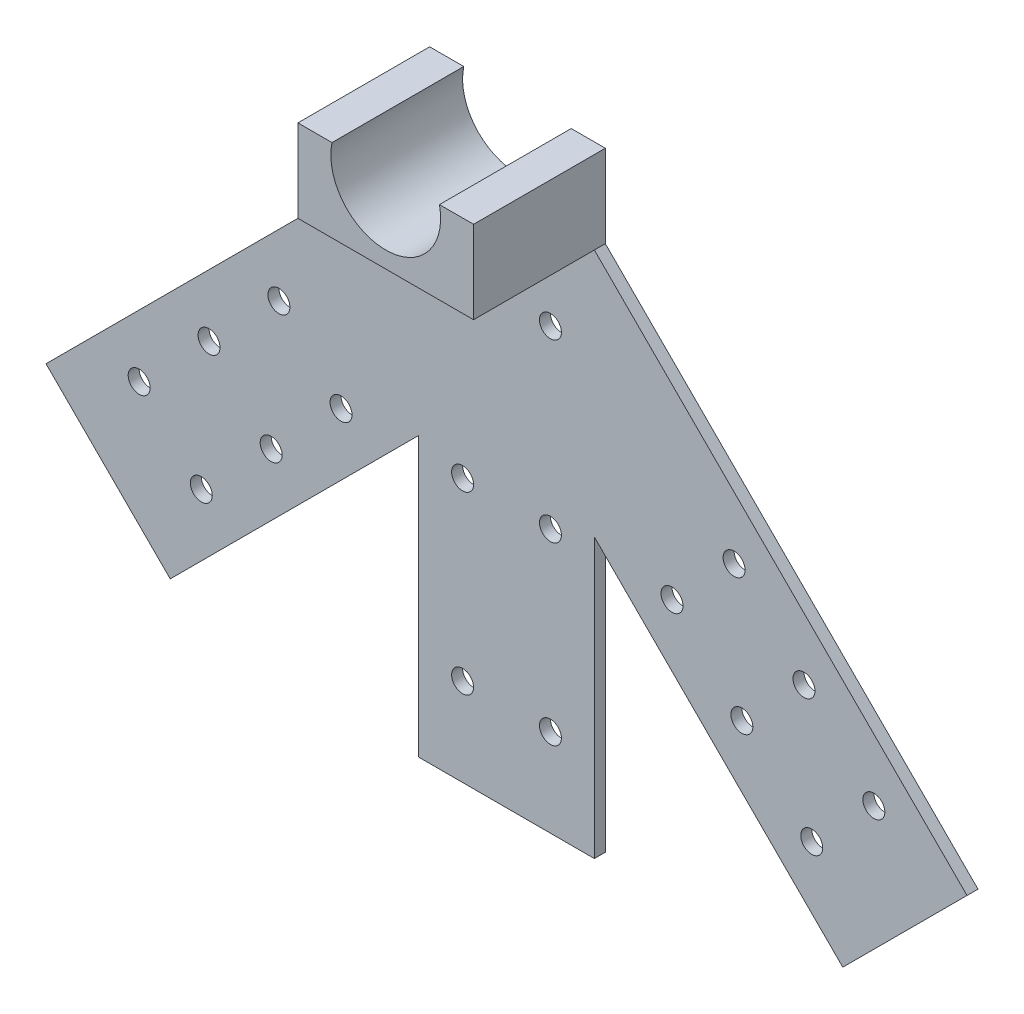
ISO-10303-21;
HEADER;
FILE_DESCRIPTION(('STEP AP214'),'2;1');
FILE_NAME('part.step','',(''),(''),'','','');
FILE_SCHEMA(('AUTOMOTIVE_DESIGN { 1 0 10303 214 1 1 1 1 }'));
ENDSEC;
DATA;
#1=APPLICATION_CONTEXT('core data for automotive mechanical design processes');
#2=APPLICATION_PROTOCOL_DEFINITION('international standard','automotive_design',2000,#1);
#3=PRODUCT_CONTEXT('',#1,'mechanical');
#4=PRODUCT('Part','Part','',(#3));
#5=PRODUCT_RELATED_PRODUCT_CATEGORY('part','',(#4));
#6=PRODUCT_DEFINITION_FORMATION('','',#4);
#7=PRODUCT_DEFINITION_CONTEXT('part definition',#1,'design');
#8=PRODUCT_DEFINITION('design','',#6,#7);
#9=PRODUCT_DEFINITION_SHAPE('','',#8);
#10=(LENGTH_UNIT() NAMED_UNIT(*) SI_UNIT(.MILLI.,.METRE.));
#11=(NAMED_UNIT(*) PLANE_ANGLE_UNIT() SI_UNIT($,.RADIAN.));
#12=(NAMED_UNIT(*) SI_UNIT($,.STERADIAN.) SOLID_ANGLE_UNIT());
#13=UNCERTAINTY_MEASURE_WITH_UNIT(LENGTH_MEASURE(1.E-05),#10,'distance_accuracy_value','');
#14=(GEOMETRIC_REPRESENTATION_CONTEXT(3) GLOBAL_UNCERTAINTY_ASSIGNED_CONTEXT((#13)) GLOBAL_UNIT_ASSIGNED_CONTEXT((#10,
#11,#12)) REPRESENTATION_CONTEXT('',''));
#15=CARTESIAN_POINT('',(0.,0.,0.));
#16=DIRECTION('',(0.,0.,1.));
#17=DIRECTION('',(1.,0.,0.));
#18=AXIS2_PLACEMENT_3D('',#15,#16,#17);
#19=CARTESIAN_POINT('',(0.,352.6,0.));
#20=DIRECTION('',(0.,1.,0.));
#21=DIRECTION('',(0.,0.,1.));
#22=AXIS2_PLACEMENT_3D('',#19,#20,#21);
#23=PLANE('',#22);
#24=DIRECTION('',(0.,0.,1.));
#25=VECTOR('',#24,1.);
#26=CARTESIAN_POINT('',(-31.0681002570091,352.6,0.));
#27=LINE('',#26,#25);
#28=CARTESIAN_POINT('',(-31.0681002570091,352.6,0.));
#29=VERTEX_POINT('',#28);
#30=CARTESIAN_POINT('',(-31.0681002570091,352.6,76.2));
#31=VERTEX_POINT('',#30);
#32=EDGE_CURVE('E252',#29,#31,#27,.T.);
#33=ORIENTED_EDGE('',*,*,#32,.F.);
#34=DIRECTION('',(-1.,0.,0.));
#35=VECTOR('',#34,1.);
#36=CARTESIAN_POINT('',(-50.8,352.6,0.));
#37=LINE('',#36,#35);
#38=CARTESIAN_POINT('',(-50.8,352.6,0.));
#39=VERTEX_POINT('',#38);
#40=EDGE_CURVE('E256',#29,#39,#37,.T.);
#41=ORIENTED_EDGE('',*,*,#40,.T.);
#42=DIRECTION('',(0.,0.,1.));
#43=VECTOR('',#42,1.);
#44=CARTESIAN_POINT('',(-50.8,352.6,0.));
#45=LINE('',#44,#43);
#46=CARTESIAN_POINT('',(-50.8,352.6,76.2));
#47=VERTEX_POINT('',#46);
#48=EDGE_CURVE('E272',#39,#47,#45,.T.);
#49=ORIENTED_EDGE('',*,*,#48,.T.);
#50=DIRECTION('',(1.,0.,0.));
#51=VECTOR('',#50,1.);
#52=CARTESIAN_POINT('',(-50.8,352.6,76.2));
#53=LINE('',#52,#51);
#54=EDGE_CURVE('E423',#47,#31,#53,.T.);
#55=ORIENTED_EDGE('',*,*,#54,.T.);
#56=EDGE_LOOP('',(#33,#41,#49,#55));
#57=FACE_BOUND('',#56,.T.);
#58=ADVANCED_FACE('F46',(#57),#23,.T.);
#59=CARTESIAN_POINT('',(0.,0.,6.35));
#60=DIRECTION('',(0.,0.,1.));
#61=DIRECTION('',(1.,0.,0.));
#62=AXIS2_PLACEMENT_3D('',#59,#60,#61);
#63=PLANE('',#62);
#64=CARTESIAN_POINT('',(-172.033457634432,147.645517881289,6.35));
#65=DIRECTION('',(0.,0.,1.));
#66=DIRECTION('',(-1.,0.,0.));
#67=AXIS2_PLACEMENT_3D('',#64,#65,#66);
#68=CIRCLE('',#67,6.34999999999999);
#69=CARTESIAN_POINT('',(-178.383457634432,147.645517881289,6.35));
#70=VERTEX_POINT('',#69);
#71=EDGE_CURVE('E288',#70,#70,#68,.T.);
#72=ORIENTED_EDGE('',*,*,#71,.F.);
#73=EDGE_LOOP('',(#72));
#74=FACE_BOUND('',#73,.T.);
#75=CARTESIAN_POINT('',(-136.112433150156,111.724493397013,6.35));
#76=DIRECTION('',(0.,0.,1.));
#77=DIRECTION('',(1.,0.,0.));
#78=AXIS2_PLACEMENT_3D('',#75,#76,#77);
#79=CIRCLE('',#78,6.34999999999996);
#80=CARTESIAN_POINT('',(-129.762433150157,111.724493397013,6.35));
#81=VERTEX_POINT('',#80);
#82=EDGE_CURVE('E300',#81,#81,#79,.T.);
#83=ORIENTED_EDGE('',*,*,#82,.F.);
#84=EDGE_LOOP('',(#83));
#85=FACE_BOUND('',#84,.T.);
#86=CARTESIAN_POINT('',(-176.523585694967,71.3133408522016,6.35));
#87=DIRECTION('',(0.,0.,1.));
#88=DIRECTION('',(1.,0.,0.));
#89=AXIS2_PLACEMENT_3D('',#86,#87,#88);
#90=CIRCLE('',#89,6.35000000000002);
#91=CARTESIAN_POINT('',(-170.173585694967,71.3133408522016,6.35));
#92=VERTEX_POINT('',#91);
#93=EDGE_CURVE('E312',#92,#92,#90,.T.);
#94=ORIENTED_EDGE('',*,*,#93,.F.);
#95=EDGE_LOOP('',(#94));
#96=FACE_BOUND('',#95,.T.);
#97=CARTESIAN_POINT('',(-25.3999999999996,152.4,6.35));
#98=DIRECTION('',(0.,0.,1.));
#99=DIRECTION('',(-1.,0.,0.));
#100=AXIS2_PLACEMENT_3D('',#97,#98,#99);
#101=CIRCLE('',#100,6.35000000000002);
#102=CARTESIAN_POINT('',(-31.7499999999997,152.4,6.35));
#103=VERTEX_POINT('',#102);
#104=EDGE_CURVE('E324',#103,#103,#101,.T.);
#105=ORIENTED_EDGE('',*,*,#104,.F.);
#106=EDGE_LOOP('',(#105));
#107=FACE_BOUND('',#106,.T.);
#108=CARTESIAN_POINT('',(25.3999999999993,254.,6.35));
#109=DIRECTION('',(0.,0.,1.));
#110=DIRECTION('',(1.,0.,0.));
#111=AXIS2_PLACEMENT_3D('',#108,#109,#110);
#112=CIRCLE('',#111,6.35);
#113=CARTESIAN_POINT('',(31.7499999999993,254.,6.35));
#114=VERTEX_POINT('',#113);
#115=EDGE_CURVE('E336',#114,#114,#112,.T.);
#116=ORIENTED_EDGE('',*,*,#115,.F.);
#117=EDGE_LOOP('',(#116));
#118=FACE_BOUND('',#117,.T.);
#119=CARTESIAN_POINT('',(25.4,50.8,6.35));
#120=DIRECTION('',(0.,0.,1.));
#121=DIRECTION('',(1.,0.,0.));
#122=AXIS2_PLACEMENT_3D('',#119,#120,#121);
#123=CIRCLE('',#122,6.35);
#124=CARTESIAN_POINT('',(31.75,50.8,6.35));
#125=VERTEX_POINT('',#124);
#126=EDGE_CURVE('E348',#125,#125,#123,.T.);
#127=ORIENTED_EDGE('',*,*,#126,.F.);
#128=EDGE_LOOP('',(#127));
#129=FACE_BOUND('',#128,.T.);
#130=CARTESIAN_POINT('',(95.7012806053459,152.135645941825,6.35));
#131=DIRECTION('',(0.,0.,1.));
#132=DIRECTION('',(-1.,0.,0.));
#133=AXIS2_PLACEMENT_3D('',#130,#131,#132);
#134=CIRCLE('',#133,6.35000000000001);
#135=CARTESIAN_POINT('',(89.3512806053458,152.135645941825,6.35));
#136=VERTEX_POINT('',#135);
#137=EDGE_CURVE('E360',#136,#136,#134,.T.);
#138=ORIENTED_EDGE('',*,*,#137,.F.);
#139=EDGE_LOOP('',(#138));
#140=FACE_BOUND('',#139,.T.);
#141=CARTESIAN_POINT('',(131.622305089621,188.0566704261,6.35));
#142=DIRECTION('',(0.,0.,1.));
#143=DIRECTION('',(1.,0.,0.));
#144=AXIS2_PLACEMENT_3D('',#141,#142,#143);
#145=CIRCLE('',#144,6.34999999999999);
#146=CARTESIAN_POINT('',(137.972305089621,188.0566704261,6.35));
#147=VERTEX_POINT('',#146);
#148=EDGE_CURVE('E372',#147,#147,#145,.T.);
#149=ORIENTED_EDGE('',*,*,#148,.F.);
#150=EDGE_LOOP('',(#149));
#151=FACE_BOUND('',#150,.T.);
#152=CARTESIAN_POINT('',(212.444610179244,107.234365336478,6.35));
#153=DIRECTION('',(0.,0.,1.));
#154=DIRECTION('',(1.,0.,0.));
#155=AXIS2_PLACEMENT_3D('',#152,#153,#154);
#156=CIRCLE('',#155,6.35000000000003);
#157=CARTESIAN_POINT('',(218.794610179244,107.234365336478,6.35));
#158=VERTEX_POINT('',#157);
#159=EDGE_CURVE('E162',#158,#158,#156,.T.);
#160=ORIENTED_EDGE('',*,*,#159,.F.);
#161=EDGE_LOOP('',(#160));
#162=FACE_BOUND('',#161,.T.);
#163=DIRECTION('',(0.,1.,0.));
#164=VECTOR('',#163,1.);
#165=CARTESIAN_POINT('',(50.8,0.,6.35));
#166=LINE('',#165,#164);
#167=CARTESIAN_POINT('',(50.8,0.,6.35));
#168=VERTEX_POINT('',#167);
#169=CARTESIAN_POINT('',(50.8,161.115902062893,6.35));
#170=VERTEX_POINT('',#169);
#171=EDGE_CURVE('E177',#168,#170,#166,.T.);
#172=ORIENTED_EDGE('',*,*,#171,.T.);
#173=DIRECTION('',(0.707106781186544,-0.707106781186551,0.));
#174=VECTOR('',#173,1.);
#175=CARTESIAN_POINT('',(50.8,161.115902062893,6.35));
#176=LINE('',#175,#174);
#177=CARTESIAN_POINT('',(194.484097937105,17.4318041257862,6.35));
#178=VERTEX_POINT('',#177);
#179=EDGE_CURVE('E111',#170,#178,#176,.T.);
#180=ORIENTED_EDGE('',*,*,#179,.T.);
#181=DIRECTION('',(0.707106781186551,0.707106781186544,0.));
#182=VECTOR('',#181,1.);
#183=CARTESIAN_POINT('',(194.484097937105,17.4318041257862,6.35));
#184=LINE('',#183,#182);
#185=CARTESIAN_POINT('',(266.326146905659,89.2738530943391,6.35));
#186=VERTEX_POINT('',#185);
#187=EDGE_CURVE('E198',#178,#186,#184,.T.);
#188=ORIENTED_EDGE('',*,*,#187,.T.);
#189=DIRECTION('',(-0.707106781186543,0.707106781186552,0.));
#190=VECTOR('',#189,1.);
#191=CARTESIAN_POINT('',(266.326146905659,89.2738530943391,6.35));
#192=LINE('',#191,#190);
#193=CARTESIAN_POINT('',(50.8,304.8,6.35));
#194=VERTEX_POINT('',#193);
#195=EDGE_CURVE('E391',#186,#194,#192,.T.);
#196=ORIENTED_EDGE('',*,*,#195,.T.);
#197=DIRECTION('',(-1.,0.,0.));
#198=VECTOR('',#197,1.);
#199=CARTESIAN_POINT('',(50.8,304.8,6.35));
#200=LINE('',#199,#198);
#201=CARTESIAN_POINT('',(-50.8,304.8,6.35));
#202=VERTEX_POINT('',#201);
#203=EDGE_CURVE('E394',#194,#202,#200,.T.);
#204=ORIENTED_EDGE('',*,*,#203,.T.);
#205=DIRECTION('',(-0.707106781186544,-0.707106781186551,0.));
#206=VECTOR('',#205,1.);
#207=CARTESIAN_POINT('',(-266.326146905659,89.2738530943391,6.35));
#208=LINE('',#207,#206);
#209=CARTESIAN_POINT('',(-266.326146905659,89.2738530943391,6.35));
#210=VERTEX_POINT('',#209);
#211=EDGE_CURVE('E397',#202,#210,#208,.T.);
#212=ORIENTED_EDGE('',*,*,#211,.T.);
#213=DIRECTION('',(0.707106781186551,-0.707106781186544,0.));
#214=VECTOR('',#213,1.);
#215=CARTESIAN_POINT('',(-194.484097937105,17.4318041257862,6.35));
#216=LINE('',#215,#214);
#217=CARTESIAN_POINT('',(-194.484097937105,17.4318041257862,6.35));
#218=VERTEX_POINT('',#217);
#219=EDGE_CURVE('E137',#210,#218,#216,.T.);
#220=ORIENTED_EDGE('',*,*,#219,.T.);
#221=DIRECTION('',(0.707106781186543,0.707106781186552,0.));
#222=VECTOR('',#221,1.);
#223=CARTESIAN_POINT('',(-50.8,161.115902062893,6.35));
#224=LINE('',#223,#222);
#225=CARTESIAN_POINT('',(-50.8,161.115902062893,6.35));
#226=VERTEX_POINT('',#225);
#227=EDGE_CURVE('E129',#218,#226,#224,.T.);
#228=ORIENTED_EDGE('',*,*,#227,.T.);
#229=DIRECTION('',(0.,-1.,0.));
#230=VECTOR('',#229,1.);
#231=CARTESIAN_POINT('',(-50.8,2.22044604925031E-13,6.35));
#232=LINE('',#231,#230);
#233=CARTESIAN_POINT('',(-50.8,2.22044604925031E-13,6.35));
#234=VERTEX_POINT('',#233);
#235=EDGE_CURVE('E134',#226,#234,#232,.T.);
#236=ORIENTED_EDGE('',*,*,#235,.T.);
#237=DIRECTION('',(1.,0.,0.));
#238=VECTOR('',#237,1.);
#239=CARTESIAN_POINT('',(-50.8,2.22044604925031E-13,6.35));
#240=LINE('',#239,#238);
#241=EDGE_CURVE('E70',#234,#168,#240,.T.);
#242=ORIENTED_EDGE('',*,*,#241,.T.);
#243=EDGE_LOOP('',(#172,#180,#188,#196,#204,#212,#220,#228,#236,#242));
#244=FACE_BOUND('',#243,.T.);
#245=CARTESIAN_POINT('',(172.033457634432,147.645517881289,6.35));
#246=DIRECTION('',(0.,0.,1.));
#247=DIRECTION('',(1.,0.,0.));
#248=AXIS2_PLACEMENT_3D('',#245,#246,#247);
#249=CIRCLE('',#248,6.34999999999999);
#250=CARTESIAN_POINT('',(178.383457634432,147.645517881289,6.35));
#251=VERTEX_POINT('',#250);
#252=EDGE_CURVE('E378',#251,#251,#249,.T.);
#253=ORIENTED_EDGE('',*,*,#252,.F.);
#254=EDGE_LOOP('',(#253));
#255=FACE_BOUND('',#254,.T.);
#256=CARTESIAN_POINT('',(136.112433150156,111.724493397013,6.35));
#257=DIRECTION('',(0.,0.,1.));
#258=DIRECTION('',(-1.,0.,0.));
#259=AXIS2_PLACEMENT_3D('',#256,#257,#258);
#260=CIRCLE('',#259,6.34999999999996);
#261=CARTESIAN_POINT('',(129.762433150157,111.724493397013,6.35));
#262=VERTEX_POINT('',#261);
#263=EDGE_CURVE('E366',#262,#262,#260,.T.);
#264=ORIENTED_EDGE('',*,*,#263,.F.);
#265=EDGE_LOOP('',(#264));
#266=FACE_BOUND('',#265,.T.);
#267=CARTESIAN_POINT('',(176.523585694967,71.3133408522015,6.35));
#268=DIRECTION('',(0.,0.,1.));
#269=DIRECTION('',(-1.,0.,0.));
#270=AXIS2_PLACEMENT_3D('',#267,#268,#269);
#271=CIRCLE('',#270,6.35000000000002);
#272=CARTESIAN_POINT('',(170.173585694967,71.3133408522015,6.35));
#273=VERTEX_POINT('',#272);
#274=EDGE_CURVE('E354',#273,#273,#271,.T.);
#275=ORIENTED_EDGE('',*,*,#274,.F.);
#276=EDGE_LOOP('',(#275));
#277=FACE_BOUND('',#276,.T.);
#278=CARTESIAN_POINT('',(25.3999999999996,152.4,6.35));
#279=DIRECTION('',(0.,0.,1.));
#280=DIRECTION('',(1.,0.,0.));
#281=AXIS2_PLACEMENT_3D('',#278,#279,#280);
#282=CIRCLE('',#281,6.35000000000001);
#283=CARTESIAN_POINT('',(31.7499999999997,152.4,6.35));
#284=VERTEX_POINT('',#283);
#285=EDGE_CURVE('E342',#284,#284,#282,.T.);
#286=ORIENTED_EDGE('',*,*,#285,.F.);
#287=EDGE_LOOP('',(#286));
#288=FACE_BOUND('',#287,.T.);
#289=CARTESIAN_POINT('',(-25.3999999999993,254.,6.35));
#290=DIRECTION('',(0.,0.,1.));
#291=DIRECTION('',(-1.,0.,0.));
#292=AXIS2_PLACEMENT_3D('',#289,#290,#291);
#293=CIRCLE('',#292,6.35);
#294=CARTESIAN_POINT('',(-31.7499999999993,254.,6.35));
#295=VERTEX_POINT('',#294);
#296=EDGE_CURVE('E330',#295,#295,#293,.T.);
#297=ORIENTED_EDGE('',*,*,#296,.F.);
#298=EDGE_LOOP('',(#297));
#299=FACE_BOUND('',#298,.T.);
#300=CARTESIAN_POINT('',(-25.4,50.8000000000002,6.35));
#301=DIRECTION('',(0.,0.,1.));
#302=DIRECTION('',(-1.,0.,0.));
#303=AXIS2_PLACEMENT_3D('',#300,#301,#302);
#304=CIRCLE('',#303,6.35);
#305=CARTESIAN_POINT('',(-31.75,50.8000000000002,6.35));
#306=VERTEX_POINT('',#305);
#307=EDGE_CURVE('E318',#306,#306,#304,.T.);
#308=ORIENTED_EDGE('',*,*,#307,.F.);
#309=EDGE_LOOP('',(#308));
#310=FACE_BOUND('',#309,.T.);
#311=CARTESIAN_POINT('',(-95.7012806053458,152.135645941825,6.35));
#312=DIRECTION('',(0.,0.,1.));
#313=DIRECTION('',(1.,0.,0.));
#314=AXIS2_PLACEMENT_3D('',#311,#312,#313);
#315=CIRCLE('',#314,6.35000000000001);
#316=CARTESIAN_POINT('',(-89.3512806053458,152.135645941825,6.35));
#317=VERTEX_POINT('',#316);
#318=EDGE_CURVE('E306',#317,#317,#315,.T.);
#319=ORIENTED_EDGE('',*,*,#318,.F.);
#320=EDGE_LOOP('',(#319));
#321=FACE_BOUND('',#320,.T.);
#322=CARTESIAN_POINT('',(-131.622305089621,188.0566704261,6.35));
#323=DIRECTION('',(0.,0.,1.));
#324=DIRECTION('',(-1.,0.,0.));
#325=AXIS2_PLACEMENT_3D('',#322,#323,#324);
#326=CIRCLE('',#325,6.34999999999999);
#327=CARTESIAN_POINT('',(-137.972305089621,188.0566704261,6.35));
#328=VERTEX_POINT('',#327);
#329=EDGE_CURVE('E294',#328,#328,#326,.T.);
#330=ORIENTED_EDGE('',*,*,#329,.F.);
#331=EDGE_LOOP('',(#330));
#332=FACE_BOUND('',#331,.T.);
#333=CARTESIAN_POINT('',(-212.444610179244,107.234365336478,6.35));
#334=DIRECTION('',(0.,0.,1.));
#335=DIRECTION('',(-1.,0.,0.));
#336=AXIS2_PLACEMENT_3D('',#333,#334,#335);
#337=CIRCLE('',#336,6.34999999999993);
#338=CARTESIAN_POINT('',(-218.794610179244,107.234365336478,6.35));
#339=VERTEX_POINT('',#338);
#340=EDGE_CURVE('E282',#339,#339,#337,.T.);
#341=ORIENTED_EDGE('',*,*,#340,.F.);
#342=EDGE_LOOP('',(#341));
#343=FACE_BOUND('',#342,.T.);
#344=ADVANCED_FACE('F131',(#74,#85,#96,#107,#118,#129,#140,#151,#162,#244,#255,#266,#277,#288,
#299,#310,#321,#332,#343),#63,.T.);
#345=CARTESIAN_POINT('',(0.,0.,0.));
#346=DIRECTION('',(0.,0.,1.));
#347=DIRECTION('',(1.,0.,0.));
#348=AXIS2_PLACEMENT_3D('',#345,#346,#347);
#349=PLANE('',#348);
#350=ORIENTED_EDGE('',*,*,#40,.F.);
#351=CARTESIAN_POINT('',(0.,346.055105316323,0.));
#352=DIRECTION('',(0.,0.,1.));
#353=DIRECTION('',(1.,0.,0.));
#354=AXIS2_PLACEMENT_3D('',#351,#352,#353);
#355=CIRCLE('',#354,31.75);
#356=CARTESIAN_POINT('',(31.0681002570091,352.6,0.));
#357=VERTEX_POINT('',#356);
#358=EDGE_CURVE('E247',#29,#357,#355,.T.);
#359=ORIENTED_EDGE('',*,*,#358,.T.);
#360=CARTESIAN_POINT('',(50.8,352.6,0.));
#361=VERTEX_POINT('',#360);
#362=EDGE_CURVE('E254',#361,#357,#37,.T.);
#363=ORIENTED_EDGE('',*,*,#362,.F.);
#364=DIRECTION('',(0.,-1.,0.));
#365=VECTOR('',#364,1.);
#366=CARTESIAN_POINT('',(50.8,352.6,0.));
#367=LINE('',#366,#365);
#368=CARTESIAN_POINT('',(50.8,304.8,0.));
#369=VERTEX_POINT('',#368);
#370=EDGE_CURVE('E209',#361,#369,#367,.T.);
#371=ORIENTED_EDGE('',*,*,#370,.T.);
#372=DIRECTION('',(-0.707106781186543,0.707106781186552,0.));
#373=VECTOR('',#372,1.);
#374=CARTESIAN_POINT('',(266.326146905659,89.2738530943391,0.));
#375=LINE('',#374,#373);
#376=CARTESIAN_POINT('',(266.326146905659,89.2738530943391,0.));
#377=VERTEX_POINT('',#376);
#378=EDGE_CURVE('E166',#377,#369,#375,.T.);
#379=ORIENTED_EDGE('',*,*,#378,.F.);
#380=DIRECTION('',(0.707106781186551,0.707106781186544,0.));
#381=VECTOR('',#380,1.);
#382=CARTESIAN_POINT('',(194.484097937105,17.4318041257862,0.));
#383=LINE('',#382,#381);
#384=CARTESIAN_POINT('',(194.484097937105,17.4318041257862,0.));
#385=VERTEX_POINT('',#384);
#386=EDGE_CURVE('E164',#385,#377,#383,.T.);
#387=ORIENTED_EDGE('',*,*,#386,.F.);
#388=DIRECTION('',(0.707106781186544,-0.707106781186551,0.));
#389=VECTOR('',#388,1.);
#390=CARTESIAN_POINT('',(50.8,161.115902062893,0.));
#391=LINE('',#390,#389);
#392=CARTESIAN_POINT('',(50.8,161.115902062893,0.));
#393=VERTEX_POINT('',#392);
#394=EDGE_CURVE('E161',#393,#385,#391,.T.);
#395=ORIENTED_EDGE('',*,*,#394,.F.);
#396=DIRECTION('',(0.,1.,0.));
#397=VECTOR('',#396,1.);
#398=CARTESIAN_POINT('',(50.8,0.,0.));
#399=LINE('',#398,#397);
#400=CARTESIAN_POINT('',(50.8,0.,0.));
#401=VERTEX_POINT('',#400);
#402=EDGE_CURVE('E158',#401,#393,#399,.T.);
#403=ORIENTED_EDGE('',*,*,#402,.F.);
#404=DIRECTION('',(1.,0.,0.));
#405=VECTOR('',#404,1.);
#406=CARTESIAN_POINT('',(-50.8,2.22044604925031E-13,0.));
#407=LINE('',#406,#405);
#408=CARTESIAN_POINT('',(-50.8,2.22044604925031E-13,0.));
#409=VERTEX_POINT('',#408);
#410=EDGE_CURVE('E103',#409,#401,#407,.T.);
#411=ORIENTED_EDGE('',*,*,#410,.F.);
#412=DIRECTION('',(0.,-1.,0.));
#413=VECTOR('',#412,1.);
#414=CARTESIAN_POINT('',(-50.8,2.22044604925031E-13,0.));
#415=LINE('',#414,#413);
#416=CARTESIAN_POINT('',(-50.8,161.115902062893,0.));
#417=VERTEX_POINT('',#416);
#418=EDGE_CURVE('E174',#417,#409,#415,.T.);
#419=ORIENTED_EDGE('',*,*,#418,.F.);
#420=DIRECTION('',(0.707106781186543,0.707106781186552,0.));
#421=VECTOR('',#420,1.);
#422=CARTESIAN_POINT('',(-50.8,161.115902062893,0.));
#423=LINE('',#422,#421);
#424=CARTESIAN_POINT('',(-194.484097937105,17.4318041257862,0.));
#425=VERTEX_POINT('',#424);
#426=EDGE_CURVE('E146',#425,#417,#423,.T.);
#427=ORIENTED_EDGE('',*,*,#426,.F.);
#428=DIRECTION('',(0.707106781186551,-0.707106781186544,0.));
#429=VECTOR('',#428,1.);
#430=CARTESIAN_POINT('',(-194.484097937105,17.4318041257862,0.));
#431=LINE('',#430,#429);
#432=CARTESIAN_POINT('',(-266.326146905659,89.2738530943391,0.));
#433=VERTEX_POINT('',#432);
#434=EDGE_CURVE('E171',#433,#425,#431,.T.);
#435=ORIENTED_EDGE('',*,*,#434,.F.);
#436=DIRECTION('',(-0.707106781186544,-0.707106781186551,0.));
#437=VECTOR('',#436,1.);
#438=CARTESIAN_POINT('',(-266.326146905659,89.2738530943391,0.));
#439=LINE('',#438,#437);
#440=CARTESIAN_POINT('',(-50.8,304.8,0.));
#441=VERTEX_POINT('',#440);
#442=EDGE_CURVE('E169',#441,#433,#439,.T.);
#443=ORIENTED_EDGE('',*,*,#442,.F.);
#444=DIRECTION('',(0.,-1.,0.));
#445=VECTOR('',#444,1.);
#446=CARTESIAN_POINT('',(-50.8,352.6,0.));
#447=LINE('',#446,#445);
#448=EDGE_CURVE('E261',#39,#441,#447,.T.);
#449=ORIENTED_EDGE('',*,*,#448,.F.);
#450=EDGE_LOOP('',(#350,#359,#363,#371,#379,#387,#395,#403,#411,#419,#427,#435,#443,#449));
#451=FACE_BOUND('',#450,.T.);
#452=CARTESIAN_POINT('',(212.444610179244,107.234365336478,0.));
#453=DIRECTION('',(0.,0.,1.));
#454=DIRECTION('',(1.,0.,0.));
#455=AXIS2_PLACEMENT_3D('',#452,#453,#454);
#456=CIRCLE('',#455,6.35000000000003);
#457=CARTESIAN_POINT('',(218.794610179244,107.234365336478,0.));
#458=VERTEX_POINT('',#457);
#459=EDGE_CURVE('E381',#458,#458,#456,.T.);
#460=ORIENTED_EDGE('',*,*,#459,.T.);
#461=EDGE_LOOP('',(#460));
#462=FACE_BOUND('',#461,.T.);
#463=CARTESIAN_POINT('',(172.033457634432,147.645517881289,0.));
#464=DIRECTION('',(0.,0.,1.));
#465=DIRECTION('',(1.,0.,0.));
#466=AXIS2_PLACEMENT_3D('',#463,#464,#465);
#467=CIRCLE('',#466,6.34999999999999);
#468=CARTESIAN_POINT('',(178.383457634432,147.645517881289,0.));
#469=VERTEX_POINT('',#468);
#470=EDGE_CURVE('E375',#469,#469,#467,.T.);
#471=ORIENTED_EDGE('',*,*,#470,.T.);
#472=EDGE_LOOP('',(#471));
#473=FACE_BOUND('',#472,.T.);
#474=CARTESIAN_POINT('',(131.622305089621,188.0566704261,0.));
#475=DIRECTION('',(0.,0.,1.));
#476=DIRECTION('',(1.,0.,0.));
#477=AXIS2_PLACEMENT_3D('',#474,#475,#476);
#478=CIRCLE('',#477,6.34999999999999);
#479=CARTESIAN_POINT('',(137.972305089621,188.0566704261,0.));
#480=VERTEX_POINT('',#479);
#481=EDGE_CURVE('E369',#480,#480,#478,.T.);
#482=ORIENTED_EDGE('',*,*,#481,.T.);
#483=EDGE_LOOP('',(#482));
#484=FACE_BOUND('',#483,.T.);
#485=CARTESIAN_POINT('',(136.112433150156,111.724493397013,0.));
#486=DIRECTION('',(0.,0.,1.));
#487=DIRECTION('',(-1.,0.,0.));
#488=AXIS2_PLACEMENT_3D('',#485,#486,#487);
#489=CIRCLE('',#488,6.34999999999996);
#490=CARTESIAN_POINT('',(129.762433150157,111.724493397013,0.));
#491=VERTEX_POINT('',#490);
#492=EDGE_CURVE('E363',#491,#491,#489,.T.);
#493=ORIENTED_EDGE('',*,*,#492,.T.);
#494=EDGE_LOOP('',(#493));
#495=FACE_BOUND('',#494,.T.);
#496=CARTESIAN_POINT('',(95.7012806053459,152.135645941825,0.));
#497=DIRECTION('',(0.,0.,1.));
#498=DIRECTION('',(-1.,0.,0.));
#499=AXIS2_PLACEMENT_3D('',#496,#497,#498);
#500=CIRCLE('',#499,6.35000000000001);
#501=CARTESIAN_POINT('',(89.3512806053458,152.135645941825,0.));
#502=VERTEX_POINT('',#501);
#503=EDGE_CURVE('E357',#502,#502,#500,.T.);
#504=ORIENTED_EDGE('',*,*,#503,.T.);
#505=EDGE_LOOP('',(#504));
#506=FACE_BOUND('',#505,.T.);
#507=CARTESIAN_POINT('',(176.523585694967,71.3133408522015,0.));
#508=DIRECTION('',(0.,0.,1.));
#509=DIRECTION('',(-1.,0.,0.));
#510=AXIS2_PLACEMENT_3D('',#507,#508,#509);
#511=CIRCLE('',#510,6.35000000000002);
#512=CARTESIAN_POINT('',(170.173585694967,71.3133408522015,0.));
#513=VERTEX_POINT('',#512);
#514=EDGE_CURVE('E351',#513,#513,#511,.T.);
#515=ORIENTED_EDGE('',*,*,#514,.T.);
#516=EDGE_LOOP('',(#515));
#517=FACE_BOUND('',#516,.T.);
#518=CARTESIAN_POINT('',(25.4,50.8,0.));
#519=DIRECTION('',(0.,0.,1.));
#520=DIRECTION('',(1.,0.,0.));
#521=AXIS2_PLACEMENT_3D('',#518,#519,#520);
#522=CIRCLE('',#521,6.35);
#523=CARTESIAN_POINT('',(31.75,50.8,0.));
#524=VERTEX_POINT('',#523);
#525=EDGE_CURVE('E345',#524,#524,#522,.T.);
#526=ORIENTED_EDGE('',*,*,#525,.T.);
#527=EDGE_LOOP('',(#526));
#528=FACE_BOUND('',#527,.T.);
#529=CARTESIAN_POINT('',(25.3999999999996,152.4,0.));
#530=DIRECTION('',(0.,0.,1.));
#531=DIRECTION('',(1.,0.,0.));
#532=AXIS2_PLACEMENT_3D('',#529,#530,#531);
#533=CIRCLE('',#532,6.35000000000001);
#534=CARTESIAN_POINT('',(31.7499999999997,152.4,0.));
#535=VERTEX_POINT('',#534);
#536=EDGE_CURVE('E339',#535,#535,#533,.T.);
#537=ORIENTED_EDGE('',*,*,#536,.T.);
#538=EDGE_LOOP('',(#537));
#539=FACE_BOUND('',#538,.T.);
#540=CARTESIAN_POINT('',(25.3999999999993,254.,0.));
#541=DIRECTION('',(0.,0.,1.));
#542=DIRECTION('',(1.,0.,0.));
#543=AXIS2_PLACEMENT_3D('',#540,#541,#542);
#544=CIRCLE('',#543,6.35);
#545=CARTESIAN_POINT('',(31.7499999999993,254.,0.));
#546=VERTEX_POINT('',#545);
#547=EDGE_CURVE('E333',#546,#546,#544,.T.);
#548=ORIENTED_EDGE('',*,*,#547,.T.);
#549=EDGE_LOOP('',(#548));
#550=FACE_BOUND('',#549,.T.);
#551=CARTESIAN_POINT('',(-25.3999999999993,254.,0.));
#552=DIRECTION('',(0.,0.,1.));
#553=DIRECTION('',(-1.,0.,0.));
#554=AXIS2_PLACEMENT_3D('',#551,#552,#553);
#555=CIRCLE('',#554,6.35);
#556=CARTESIAN_POINT('',(-31.7499999999993,254.,0.));
#557=VERTEX_POINT('',#556);
#558=EDGE_CURVE('E327',#557,#557,#555,.T.);
#559=ORIENTED_EDGE('',*,*,#558,.T.);
#560=EDGE_LOOP('',(#559));
#561=FACE_BOUND('',#560,.T.);
#562=CARTESIAN_POINT('',(-25.3999999999996,152.4,0.));
#563=DIRECTION('',(0.,0.,1.));
#564=DIRECTION('',(-1.,0.,0.));
#565=AXIS2_PLACEMENT_3D('',#562,#563,#564);
#566=CIRCLE('',#565,6.35000000000002);
#567=CARTESIAN_POINT('',(-31.7499999999997,152.4,0.));
#568=VERTEX_POINT('',#567);
#569=EDGE_CURVE('E321',#568,#568,#566,.T.);
#570=ORIENTED_EDGE('',*,*,#569,.T.);
#571=EDGE_LOOP('',(#570));
#572=FACE_BOUND('',#571,.T.);
#573=CARTESIAN_POINT('',(-25.4,50.8000000000002,0.));
#574=DIRECTION('',(0.,0.,1.));
#575=DIRECTION('',(-1.,0.,0.));
#576=AXIS2_PLACEMENT_3D('',#573,#574,#575);
#577=CIRCLE('',#576,6.35);
#578=CARTESIAN_POINT('',(-31.75,50.8000000000002,0.));
#579=VERTEX_POINT('',#578);
#580=EDGE_CURVE('E315',#579,#579,#577,.T.);
#581=ORIENTED_EDGE('',*,*,#580,.T.);
#582=EDGE_LOOP('',(#581));
#583=FACE_BOUND('',#582,.T.);
#584=CARTESIAN_POINT('',(-176.523585694967,71.3133408522016,0.));
#585=DIRECTION('',(0.,0.,1.));
#586=DIRECTION('',(1.,0.,0.));
#587=AXIS2_PLACEMENT_3D('',#584,#585,#586);
#588=CIRCLE('',#587,6.35000000000002);
#589=CARTESIAN_POINT('',(-170.173585694967,71.3133408522016,0.));
#590=VERTEX_POINT('',#589);
#591=EDGE_CURVE('E309',#590,#590,#588,.T.);
#592=ORIENTED_EDGE('',*,*,#591,.T.);
#593=EDGE_LOOP('',(#592));
#594=FACE_BOUND('',#593,.T.);
#595=CARTESIAN_POINT('',(-95.7012806053458,152.135645941825,0.));
#596=DIRECTION('',(0.,0.,1.));
#597=DIRECTION('',(1.,0.,0.));
#598=AXIS2_PLACEMENT_3D('',#595,#596,#597);
#599=CIRCLE('',#598,6.35000000000001);
#600=CARTESIAN_POINT('',(-89.3512806053458,152.135645941825,0.));
#601=VERTEX_POINT('',#600);
#602=EDGE_CURVE('E303',#601,#601,#599,.T.);
#603=ORIENTED_EDGE('',*,*,#602,.T.);
#604=EDGE_LOOP('',(#603));
#605=FACE_BOUND('',#604,.T.);
#606=CARTESIAN_POINT('',(-136.112433150156,111.724493397013,0.));
#607=DIRECTION('',(0.,0.,1.));
#608=DIRECTION('',(1.,0.,0.));
#609=AXIS2_PLACEMENT_3D('',#606,#607,#608);
#610=CIRCLE('',#609,6.34999999999996);
#611=CARTESIAN_POINT('',(-129.762433150157,111.724493397013,0.));
#612=VERTEX_POINT('',#611);
#613=EDGE_CURVE('E297',#612,#612,#610,.T.);
#614=ORIENTED_EDGE('',*,*,#613,.T.);
#615=EDGE_LOOP('',(#614));
#616=FACE_BOUND('',#615,.T.);
#617=CARTESIAN_POINT('',(-131.622305089621,188.0566704261,0.));
#618=DIRECTION('',(0.,0.,1.));
#619=DIRECTION('',(-1.,0.,0.));
#620=AXIS2_PLACEMENT_3D('',#617,#618,#619);
#621=CIRCLE('',#620,6.34999999999999);
#622=CARTESIAN_POINT('',(-137.972305089621,188.0566704261,0.));
#623=VERTEX_POINT('',#622);
#624=EDGE_CURVE('E291',#623,#623,#621,.T.);
#625=ORIENTED_EDGE('',*,*,#624,.T.);
#626=EDGE_LOOP('',(#625));
#627=FACE_BOUND('',#626,.T.);
#628=CARTESIAN_POINT('',(-172.033457634432,147.645517881289,0.));
#629=DIRECTION('',(0.,0.,1.));
#630=DIRECTION('',(-1.,0.,0.));
#631=AXIS2_PLACEMENT_3D('',#628,#629,#630);
#632=CIRCLE('',#631,6.34999999999999);
#633=CARTESIAN_POINT('',(-178.383457634432,147.645517881289,0.));
#634=VERTEX_POINT('',#633);
#635=EDGE_CURVE('E285',#634,#634,#632,.T.);
#636=ORIENTED_EDGE('',*,*,#635,.T.);
#637=EDGE_LOOP('',(#636));
#638=FACE_BOUND('',#637,.T.);
#639=CARTESIAN_POINT('',(-212.444610179244,107.234365336478,0.));
#640=DIRECTION('',(0.,0.,1.));
#641=DIRECTION('',(-1.,0.,0.));
#642=AXIS2_PLACEMENT_3D('',#639,#640,#641);
#643=CIRCLE('',#642,6.34999999999993);
#644=CARTESIAN_POINT('',(-218.794610179244,107.234365336478,0.));
#645=VERTEX_POINT('',#644);
#646=EDGE_CURVE('E281',#645,#645,#643,.T.);
#647=ORIENTED_EDGE('',*,*,#646,.T.);
#648=EDGE_LOOP('',(#647));
#649=FACE_BOUND('',#648,.T.);
#650=ADVANCED_FACE('F202',(#451,#462,#473,#484,#495,#506,#517,#528,#539,#550,#561,#572,#583,
#594,#605,#616,#627,#638,#649),#349,.F.);
#651=CARTESIAN_POINT('',(50.8,0.,6.35));
#652=DIRECTION('',(-1.,0.,0.));
#653=DIRECTION('',(0.,0.,1.));
#654=AXIS2_PLACEMENT_3D('',#651,#652,#653);
#655=PLANE('',#654);
#656=ORIENTED_EDGE('',*,*,#402,.T.);
#657=DIRECTION('',(0.,0.,-1.));
#658=VECTOR('',#657,1.);
#659=CARTESIAN_POINT('',(50.8,161.115902062893,6.35));
#660=LINE('',#659,#658);
#661=EDGE_CURVE('E13',#170,#393,#660,.T.);
#662=ORIENTED_EDGE('',*,*,#661,.F.);
#663=ORIENTED_EDGE('',*,*,#171,.F.);
#664=DIRECTION('',(0.,0.,-1.));
#665=VECTOR('',#664,1.);
#666=CARTESIAN_POINT('',(50.8,0.,6.35));
#667=LINE('',#666,#665);
#668=EDGE_CURVE('E154',#168,#401,#667,.T.);
#669=ORIENTED_EDGE('',*,*,#668,.T.);
#670=EDGE_LOOP('',(#656,#662,#663,#669));
#671=FACE_BOUND('',#670,.T.);
#672=ADVANCED_FACE('F48',(#671),#655,.F.);
#673=CARTESIAN_POINT('',(50.8,161.115902062893,6.35));
#674=DIRECTION('',(0.707106781186551,0.707106781186544,0.));
#675=DIRECTION('',(-0.707106781186544,0.707106781186551,0.));
#676=AXIS2_PLACEMENT_3D('',#673,#674,#675);
#677=PLANE('',#676);
#678=ORIENTED_EDGE('',*,*,#394,.T.);
#679=DIRECTION('',(0.,0.,-1.));
#680=VECTOR('',#679,1.);
#681=CARTESIAN_POINT('',(194.484097937105,17.4318041257862,6.35));
#682=LINE('',#681,#680);
#683=EDGE_CURVE('E54',#178,#385,#682,.T.);
#684=ORIENTED_EDGE('',*,*,#683,.F.);
#685=ORIENTED_EDGE('',*,*,#179,.F.);
#686=ORIENTED_EDGE('',*,*,#661,.T.);
#687=EDGE_LOOP('',(#678,#684,#685,#686));
#688=FACE_BOUND('',#687,.T.);
#689=ADVANCED_FACE('F541',(#688),#677,.F.);
#690=CARTESIAN_POINT('',(194.484097937105,17.4318041257862,6.35));
#691=DIRECTION('',(-0.707106781186544,0.707106781186551,0.));
#692=DIRECTION('',(-0.707106781186551,-0.707106781186544,0.));
#693=AXIS2_PLACEMENT_3D('',#690,#691,#692);
#694=PLANE('',#693);
#695=ORIENTED_EDGE('',*,*,#386,.T.);
#696=DIRECTION('',(0.,0.,-1.));
#697=VECTOR('',#696,1.);
#698=CARTESIAN_POINT('',(266.326146905659,89.2738530943391,6.35));
#699=LINE('',#698,#697);
#700=EDGE_CURVE('E190',#186,#377,#699,.T.);
#701=ORIENTED_EDGE('',*,*,#700,.F.);
#702=ORIENTED_EDGE('',*,*,#187,.F.);
#703=ORIENTED_EDGE('',*,*,#683,.T.);
#704=EDGE_LOOP('',(#695,#701,#702,#703));
#705=FACE_BOUND('',#704,.T.);
#706=ADVANCED_FACE('F196',(#705),#694,.F.);
#707=CARTESIAN_POINT('',(266.326146905659,89.2738530943391,6.35));
#708=DIRECTION('',(-0.707106781186551,-0.707106781186543,0.));
#709=DIRECTION('',(0.707106781186544,-0.707106781186552,0.));
#710=AXIS2_PLACEMENT_3D('',#707,#708,#709);
#711=PLANE('',#710);
#712=ORIENTED_EDGE('',*,*,#378,.T.);
#713=DIRECTION('',(0.,0.,-1.));
#714=VECTOR('',#713,1.);
#715=CARTESIAN_POINT('',(50.8,304.8,6.35));
#716=LINE('',#715,#714);
#717=EDGE_CURVE('E187',#194,#369,#716,.T.);
#718=ORIENTED_EDGE('',*,*,#717,.F.);
#719=ORIENTED_EDGE('',*,*,#195,.F.);
#720=ORIENTED_EDGE('',*,*,#700,.T.);
#721=EDGE_LOOP('',(#712,#718,#719,#720));
#722=FACE_BOUND('',#721,.T.);
#723=ADVANCED_FACE('F212',(#722),#711,.F.);
#724=CARTESIAN_POINT('',(-266.326146905659,89.2738530943391,6.35));
#725=DIRECTION('',(0.707106781186551,-0.707106781186543,0.));
#726=DIRECTION('',(0.707106781186544,0.707106781186551,0.));
#727=AXIS2_PLACEMENT_3D('',#724,#725,#726);
#728=PLANE('',#727);
#729=ORIENTED_EDGE('',*,*,#442,.T.);
#730=DIRECTION('',(0.,0.,-1.));
#731=VECTOR('',#730,1.);
#732=CARTESIAN_POINT('',(-266.326146905659,89.2738530943391,6.35));
#733=LINE('',#732,#731);
#734=EDGE_CURVE('E181',#210,#433,#733,.T.);
#735=ORIENTED_EDGE('',*,*,#734,.F.);
#736=ORIENTED_EDGE('',*,*,#211,.F.);
#737=DIRECTION('',(0.,0.,-1.));
#738=VECTOR('',#737,1.);
#739=CARTESIAN_POINT('',(-50.8,304.8,6.35));
#740=LINE('',#739,#738);
#741=EDGE_CURVE('E184',#202,#441,#740,.T.);
#742=ORIENTED_EDGE('',*,*,#741,.T.);
#743=EDGE_LOOP('',(#729,#735,#736,#742));
#744=FACE_BOUND('',#743,.T.);
#745=ADVANCED_FACE('F402',(#744),#728,.F.);
#746=CARTESIAN_POINT('',(-194.484097937105,17.4318041257862,6.35));
#747=DIRECTION('',(0.707106781186544,0.707106781186551,0.));
#748=DIRECTION('',(-0.707106781186551,0.707106781186544,0.));
#749=AXIS2_PLACEMENT_3D('',#746,#747,#748);
#750=PLANE('',#749);
#751=ORIENTED_EDGE('',*,*,#434,.T.);
#752=DIRECTION('',(0.,0.,-1.));
#753=VECTOR('',#752,1.);
#754=CARTESIAN_POINT('',(-194.484097937105,17.4318041257862,6.35));
#755=LINE('',#754,#753);
#756=EDGE_CURVE('E149',#218,#425,#755,.T.);
#757=ORIENTED_EDGE('',*,*,#756,.F.);
#758=ORIENTED_EDGE('',*,*,#219,.F.);
#759=ORIENTED_EDGE('',*,*,#734,.T.);
#760=EDGE_LOOP('',(#751,#757,#758,#759));
#761=FACE_BOUND('',#760,.T.);
#762=ADVANCED_FACE('F406',(#761),#750,.F.);
#763=CARTESIAN_POINT('',(-50.8,161.115902062893,6.35));
#764=DIRECTION('',(-0.707106781186552,0.707106781186543,0.));
#765=DIRECTION('',(-0.707106781186543,-0.707106781186552,0.));
#766=AXIS2_PLACEMENT_3D('',#763,#764,#765);
#767=PLANE('',#766);
#768=ORIENTED_EDGE('',*,*,#426,.T.);
#769=DIRECTION('',(0.,0.,-1.));
#770=VECTOR('',#769,1.);
#771=CARTESIAN_POINT('',(-50.8,161.115902062893,6.35));
#772=LINE('',#771,#770);
#773=EDGE_CURVE('E143',#226,#417,#772,.T.);
#774=ORIENTED_EDGE('',*,*,#773,.F.);
#775=ORIENTED_EDGE('',*,*,#227,.F.);
#776=ORIENTED_EDGE('',*,*,#756,.T.);
#777=EDGE_LOOP('',(#768,#774,#775,#776));
#778=FACE_BOUND('',#777,.T.);
#779=ADVANCED_FACE('F144',(#778),#767,.F.);
#780=CARTESIAN_POINT('',(-50.8,2.22044604925031E-13,6.35));
#781=DIRECTION('',(1.,0.,0.));
#782=DIRECTION('',(0.,0.,-1.));
#783=AXIS2_PLACEMENT_3D('',#780,#781,#782);
#784=PLANE('',#783);
#785=ORIENTED_EDGE('',*,*,#418,.T.);
#786=DIRECTION('',(0.,0.,-1.));
#787=VECTOR('',#786,1.);
#788=CARTESIAN_POINT('',(-50.8,2.22044604925031E-13,6.35));
#789=LINE('',#788,#787);
#790=EDGE_CURVE('E150',#234,#409,#789,.T.);
#791=ORIENTED_EDGE('',*,*,#790,.F.);
#792=ORIENTED_EDGE('',*,*,#235,.F.);
#793=ORIENTED_EDGE('',*,*,#773,.T.);
#794=EDGE_LOOP('',(#785,#791,#792,#793));
#795=FACE_BOUND('',#794,.T.);
#796=ADVANCED_FACE('F152',(#795),#784,.F.);
#797=CARTESIAN_POINT('',(-50.8,2.22044604925031E-13,6.35));
#798=DIRECTION('',(0.,1.,0.));
#799=DIRECTION('',(-1.,0.,0.));
#800=AXIS2_PLACEMENT_3D('',#797,#798,#799);
#801=PLANE('',#800);
#802=ORIENTED_EDGE('',*,*,#410,.T.);
#803=ORIENTED_EDGE('',*,*,#668,.F.);
#804=ORIENTED_EDGE('',*,*,#241,.F.);
#805=ORIENTED_EDGE('',*,*,#790,.T.);
#806=EDGE_LOOP('',(#802,#803,#804,#805));
#807=FACE_BOUND('',#806,.T.);
#808=ADVANCED_FACE('F407',(#807),#801,.F.);
#809=CARTESIAN_POINT('',(212.444610179244,107.234365336478,6.35));
#810=DIRECTION('',(0.,0.,-1.));
#811=DIRECTION('',(-1.,0.,0.));
#812=AXIS2_PLACEMENT_3D('',#809,#810,#811);
#813=CYLINDRICAL_SURFACE('',#812,6.35000000000003);
#814=ORIENTED_EDGE('',*,*,#159,.T.);
#815=EDGE_LOOP('',(#814));
#816=FACE_BOUND('',#815,.T.);
#817=ORIENTED_EDGE('',*,*,#459,.F.);
#818=EDGE_LOOP('',(#817));
#819=FACE_BOUND('',#818,.T.);
#820=ADVANCED_FACE('F521',(#816,#819),#813,.F.);
#821=CARTESIAN_POINT('',(172.033457634432,147.645517881289,6.35));
#822=DIRECTION('',(0.,0.,-1.));
#823=DIRECTION('',(-1.,0.,0.));
#824=AXIS2_PLACEMENT_3D('',#821,#822,#823);
#825=CYLINDRICAL_SURFACE('',#824,6.34999999999999);
#826=ORIENTED_EDGE('',*,*,#252,.T.);
#827=EDGE_LOOP('',(#826));
#828=FACE_BOUND('',#827,.T.);
#829=ORIENTED_EDGE('',*,*,#470,.F.);
#830=EDGE_LOOP('',(#829));
#831=FACE_BOUND('',#830,.T.);
#832=ADVANCED_FACE('F517',(#828,#831),#825,.F.);
#833=CARTESIAN_POINT('',(131.622305089621,188.0566704261,6.35));
#834=DIRECTION('',(0.,0.,-1.));
#835=DIRECTION('',(-1.,0.,0.));
#836=AXIS2_PLACEMENT_3D('',#833,#834,#835);
#837=CYLINDRICAL_SURFACE('',#836,6.34999999999999);
#838=ORIENTED_EDGE('',*,*,#148,.T.);
#839=EDGE_LOOP('',(#838));
#840=FACE_BOUND('',#839,.T.);
#841=ORIENTED_EDGE('',*,*,#481,.F.);
#842=EDGE_LOOP('',(#841));
#843=FACE_BOUND('',#842,.T.);
#844=ADVANCED_FACE('F513',(#840,#843),#837,.F.);
#845=CARTESIAN_POINT('',(136.112433150156,111.724493397013,6.35));
#846=DIRECTION('',(0.,0.,-1.));
#847=DIRECTION('',(-1.,0.,0.));
#848=AXIS2_PLACEMENT_3D('',#845,#846,#847);
#849=CYLINDRICAL_SURFACE('',#848,6.34999999999996);
#850=ORIENTED_EDGE('',*,*,#263,.T.);
#851=EDGE_LOOP('',(#850));
#852=FACE_BOUND('',#851,.T.);
#853=ORIENTED_EDGE('',*,*,#492,.F.);
#854=EDGE_LOOP('',(#853));
#855=FACE_BOUND('',#854,.T.);
#856=ADVANCED_FACE('F509',(#852,#855),#849,.F.);
#857=CARTESIAN_POINT('',(95.7012806053459,152.135645941825,6.35));
#858=DIRECTION('',(0.,0.,-1.));
#859=DIRECTION('',(-1.,0.,0.));
#860=AXIS2_PLACEMENT_3D('',#857,#858,#859);
#861=CYLINDRICAL_SURFACE('',#860,6.35000000000001);
#862=ORIENTED_EDGE('',*,*,#137,.T.);
#863=EDGE_LOOP('',(#862));
#864=FACE_BOUND('',#863,.T.);
#865=ORIENTED_EDGE('',*,*,#503,.F.);
#866=EDGE_LOOP('',(#865));
#867=FACE_BOUND('',#866,.T.);
#868=ADVANCED_FACE('F505',(#864,#867),#861,.F.);
#869=CARTESIAN_POINT('',(176.523585694967,71.3133408522015,6.35));
#870=DIRECTION('',(0.,0.,-1.));
#871=DIRECTION('',(-1.,0.,0.));
#872=AXIS2_PLACEMENT_3D('',#869,#870,#871);
#873=CYLINDRICAL_SURFACE('',#872,6.35000000000002);
#874=ORIENTED_EDGE('',*,*,#274,.T.);
#875=EDGE_LOOP('',(#874));
#876=FACE_BOUND('',#875,.T.);
#877=ORIENTED_EDGE('',*,*,#514,.F.);
#878=EDGE_LOOP('',(#877));
#879=FACE_BOUND('',#878,.T.);
#880=ADVANCED_FACE('F501',(#876,#879),#873,.F.);
#881=CARTESIAN_POINT('',(25.4,50.8,6.35));
#882=DIRECTION('',(0.,0.,-1.));
#883=DIRECTION('',(-1.,0.,0.));
#884=AXIS2_PLACEMENT_3D('',#881,#882,#883);
#885=CYLINDRICAL_SURFACE('',#884,6.35);
#886=ORIENTED_EDGE('',*,*,#126,.T.);
#887=EDGE_LOOP('',(#886));
#888=FACE_BOUND('',#887,.T.);
#889=ORIENTED_EDGE('',*,*,#525,.F.);
#890=EDGE_LOOP('',(#889));
#891=FACE_BOUND('',#890,.T.);
#892=ADVANCED_FACE('F497',(#888,#891),#885,.F.);
#893=CARTESIAN_POINT('',(25.3999999999996,152.4,6.35));
#894=DIRECTION('',(0.,0.,-1.));
#895=DIRECTION('',(-1.,0.,0.));
#896=AXIS2_PLACEMENT_3D('',#893,#894,#895);
#897=CYLINDRICAL_SURFACE('',#896,6.35000000000001);
#898=ORIENTED_EDGE('',*,*,#285,.T.);
#899=EDGE_LOOP('',(#898));
#900=FACE_BOUND('',#899,.T.);
#901=ORIENTED_EDGE('',*,*,#536,.F.);
#902=EDGE_LOOP('',(#901));
#903=FACE_BOUND('',#902,.T.);
#904=ADVANCED_FACE('F493',(#900,#903),#897,.F.);
#905=CARTESIAN_POINT('',(25.3999999999993,254.,6.35));
#906=DIRECTION('',(0.,0.,-1.));
#907=DIRECTION('',(-1.,0.,0.));
#908=AXIS2_PLACEMENT_3D('',#905,#906,#907);
#909=CYLINDRICAL_SURFACE('',#908,6.35);
#910=ORIENTED_EDGE('',*,*,#115,.T.);
#911=EDGE_LOOP('',(#910));
#912=FACE_BOUND('',#911,.T.);
#913=ORIENTED_EDGE('',*,*,#547,.F.);
#914=EDGE_LOOP('',(#913));
#915=FACE_BOUND('',#914,.T.);
#916=ADVANCED_FACE('F489',(#912,#915),#909,.F.);
#917=CARTESIAN_POINT('',(-25.3999999999993,254.,6.35));
#918=DIRECTION('',(0.,0.,-1.));
#919=DIRECTION('',(-1.,0.,0.));
#920=AXIS2_PLACEMENT_3D('',#917,#918,#919);
#921=CYLINDRICAL_SURFACE('',#920,6.35);
#922=ORIENTED_EDGE('',*,*,#296,.T.);
#923=EDGE_LOOP('',(#922));
#924=FACE_BOUND('',#923,.T.);
#925=ORIENTED_EDGE('',*,*,#558,.F.);
#926=EDGE_LOOP('',(#925));
#927=FACE_BOUND('',#926,.T.);
#928=ADVANCED_FACE('F485',(#924,#927),#921,.F.);
#929=CARTESIAN_POINT('',(-25.3999999999996,152.4,6.35));
#930=DIRECTION('',(0.,0.,-1.));
#931=DIRECTION('',(-1.,0.,0.));
#932=AXIS2_PLACEMENT_3D('',#929,#930,#931);
#933=CYLINDRICAL_SURFACE('',#932,6.35000000000002);
#934=ORIENTED_EDGE('',*,*,#104,.T.);
#935=EDGE_LOOP('',(#934));
#936=FACE_BOUND('',#935,.T.);
#937=ORIENTED_EDGE('',*,*,#569,.F.);
#938=EDGE_LOOP('',(#937));
#939=FACE_BOUND('',#938,.T.);
#940=ADVANCED_FACE('F481',(#936,#939),#933,.F.);
#941=CARTESIAN_POINT('',(-25.4,50.8000000000002,6.35));
#942=DIRECTION('',(0.,0.,-1.));
#943=DIRECTION('',(-1.,0.,0.));
#944=AXIS2_PLACEMENT_3D('',#941,#942,#943);
#945=CYLINDRICAL_SURFACE('',#944,6.35);
#946=ORIENTED_EDGE('',*,*,#307,.T.);
#947=EDGE_LOOP('',(#946));
#948=FACE_BOUND('',#947,.T.);
#949=ORIENTED_EDGE('',*,*,#580,.F.);
#950=EDGE_LOOP('',(#949));
#951=FACE_BOUND('',#950,.T.);
#952=ADVANCED_FACE('F477',(#948,#951),#945,.F.);
#953=CARTESIAN_POINT('',(-176.523585694967,71.3133408522016,6.35));
#954=DIRECTION('',(0.,0.,-1.));
#955=DIRECTION('',(-1.,0.,0.));
#956=AXIS2_PLACEMENT_3D('',#953,#954,#955);
#957=CYLINDRICAL_SURFACE('',#956,6.35000000000002);
#958=ORIENTED_EDGE('',*,*,#93,.T.);
#959=EDGE_LOOP('',(#958));
#960=FACE_BOUND('',#959,.T.);
#961=ORIENTED_EDGE('',*,*,#591,.F.);
#962=EDGE_LOOP('',(#961));
#963=FACE_BOUND('',#962,.T.);
#964=ADVANCED_FACE('F473',(#960,#963),#957,.F.);
#965=CARTESIAN_POINT('',(-95.7012806053458,152.135645941825,6.35));
#966=DIRECTION('',(0.,0.,-1.));
#967=DIRECTION('',(-1.,0.,0.));
#968=AXIS2_PLACEMENT_3D('',#965,#966,#967);
#969=CYLINDRICAL_SURFACE('',#968,6.35000000000001);
#970=ORIENTED_EDGE('',*,*,#318,.T.);
#971=EDGE_LOOP('',(#970));
#972=FACE_BOUND('',#971,.T.);
#973=ORIENTED_EDGE('',*,*,#602,.F.);
#974=EDGE_LOOP('',(#973));
#975=FACE_BOUND('',#974,.T.);
#976=ADVANCED_FACE('F469',(#972,#975),#969,.F.);
#977=CARTESIAN_POINT('',(-136.112433150156,111.724493397013,6.35));
#978=DIRECTION('',(0.,0.,-1.));
#979=DIRECTION('',(-1.,0.,0.));
#980=AXIS2_PLACEMENT_3D('',#977,#978,#979);
#981=CYLINDRICAL_SURFACE('',#980,6.34999999999996);
#982=ORIENTED_EDGE('',*,*,#82,.T.);
#983=EDGE_LOOP('',(#982));
#984=FACE_BOUND('',#983,.T.);
#985=ORIENTED_EDGE('',*,*,#613,.F.);
#986=EDGE_LOOP('',(#985));
#987=FACE_BOUND('',#986,.T.);
#988=ADVANCED_FACE('F465',(#984,#987),#981,.F.);
#989=CARTESIAN_POINT('',(-131.622305089621,188.0566704261,6.35));
#990=DIRECTION('',(0.,0.,-1.));
#991=DIRECTION('',(-1.,0.,0.));
#992=AXIS2_PLACEMENT_3D('',#989,#990,#991);
#993=CYLINDRICAL_SURFACE('',#992,6.34999999999999);
#994=ORIENTED_EDGE('',*,*,#329,.T.);
#995=EDGE_LOOP('',(#994));
#996=FACE_BOUND('',#995,.T.);
#997=ORIENTED_EDGE('',*,*,#624,.F.);
#998=EDGE_LOOP('',(#997));
#999=FACE_BOUND('',#998,.T.);
#1000=ADVANCED_FACE('F461',(#996,#999),#993,.F.);
#1001=CARTESIAN_POINT('',(-172.033457634432,147.645517881289,6.35));
#1002=DIRECTION('',(0.,0.,-1.));
#1003=DIRECTION('',(-1.,0.,0.));
#1004=AXIS2_PLACEMENT_3D('',#1001,#1002,#1003);
#1005=CYLINDRICAL_SURFACE('',#1004,6.34999999999999);
#1006=ORIENTED_EDGE('',*,*,#71,.T.);
#1007=EDGE_LOOP('',(#1006));
#1008=FACE_BOUND('',#1007,.T.);
#1009=ORIENTED_EDGE('',*,*,#635,.F.);
#1010=EDGE_LOOP('',(#1009));
#1011=FACE_BOUND('',#1010,.T.);
#1012=ADVANCED_FACE('F457',(#1008,#1011),#1005,.F.);
#1013=CARTESIAN_POINT('',(-212.444610179244,107.234365336478,6.35));
#1014=DIRECTION('',(0.,0.,-1.));
#1015=DIRECTION('',(-1.,0.,0.));
#1016=AXIS2_PLACEMENT_3D('',#1013,#1014,#1015);
#1017=CYLINDRICAL_SURFACE('',#1016,6.34999999999993);
#1018=ORIENTED_EDGE('',*,*,#340,.T.);
#1019=EDGE_LOOP('',(#1018));
#1020=FACE_BOUND('',#1019,.T.);
#1021=ORIENTED_EDGE('',*,*,#646,.F.);
#1022=EDGE_LOOP('',(#1021));
#1023=FACE_BOUND('',#1022,.T.);
#1024=ADVANCED_FACE('F454',(#1020,#1023),#1017,.F.);
#1025=CARTESIAN_POINT('',(-50.8,352.6,0.));
#1026=DIRECTION('',(1.,0.,0.));
#1027=DIRECTION('',(0.,0.,-1.));
#1028=AXIS2_PLACEMENT_3D('',#1025,#1026,#1027);
#1029=PLANE('',#1028);
#1030=ORIENTED_EDGE('',*,*,#741,.F.);
#1031=DIRECTION('',(0.,0.,1.));
#1032=VECTOR('',#1031,1.);
#1033=CARTESIAN_POINT('',(-50.8,304.8,0.));
#1034=LINE('',#1033,#1032);
#1035=CARTESIAN_POINT('',(-50.8,304.8,76.2));
#1036=VERTEX_POINT('',#1035);
#1037=EDGE_CURVE('E267',#202,#1036,#1034,.T.);
#1038=ORIENTED_EDGE('',*,*,#1037,.T.);
#1039=DIRECTION('',(0.,-1.,0.));
#1040=VECTOR('',#1039,1.);
#1041=CARTESIAN_POINT('',(-50.8,352.6,76.2));
#1042=LINE('',#1041,#1040);
#1043=EDGE_CURVE('E278',#47,#1036,#1042,.T.);
#1044=ORIENTED_EDGE('',*,*,#1043,.F.);
#1045=ORIENTED_EDGE('',*,*,#48,.F.);
#1046=ORIENTED_EDGE('',*,*,#448,.T.);
#1047=EDGE_LOOP('',(#1030,#1038,#1044,#1045,#1046));
#1048=FACE_BOUND('',#1047,.T.);
#1049=ADVANCED_FACE('F427',(#1048),#1029,.F.);
#1050=CARTESIAN_POINT('',(-50.8,352.6,76.2));
#1051=DIRECTION('',(0.,0.,-1.));
#1052=DIRECTION('',(-1.,0.,0.));
#1053=AXIS2_PLACEMENT_3D('',#1050,#1051,#1052);
#1054=PLANE('',#1053);
#1055=CARTESIAN_POINT('',(31.0681002570091,352.6,76.2));
#1056=VERTEX_POINT('',#1055);
#1057=CARTESIAN_POINT('',(50.8,352.6,76.2));
#1058=VERTEX_POINT('',#1057);
#1059=EDGE_CURVE('E420',#1056,#1058,#53,.T.);
#1060=ORIENTED_EDGE('',*,*,#1059,.F.);
#1061=CARTESIAN_POINT('',(0.,346.055105316323,76.2));
#1062=DIRECTION('',(0.,0.,1.));
#1063=DIRECTION('',(1.,0.,0.));
#1064=AXIS2_PLACEMENT_3D('',#1061,#1062,#1063);
#1065=CIRCLE('',#1064,31.75);
#1066=EDGE_CURVE('E61',#31,#1056,#1065,.T.);
#1067=ORIENTED_EDGE('',*,*,#1066,.F.);
#1068=ORIENTED_EDGE('',*,*,#54,.F.);
#1069=ORIENTED_EDGE('',*,*,#1043,.T.);
#1070=DIRECTION('',(1.,0.,0.));
#1071=VECTOR('',#1070,1.);
#1072=CARTESIAN_POINT('',(-50.8,304.8,76.2));
#1073=LINE('',#1072,#1071);
#1074=CARTESIAN_POINT('',(50.8,304.8,76.2));
#1075=VERTEX_POINT('',#1074);
#1076=EDGE_CURVE('E269',#1036,#1075,#1073,.T.);
#1077=ORIENTED_EDGE('',*,*,#1076,.T.);
#1078=DIRECTION('',(0.,-1.,0.));
#1079=VECTOR('',#1078,1.);
#1080=CARTESIAN_POINT('',(50.8,352.6,76.2));
#1081=LINE('',#1080,#1079);
#1082=EDGE_CURVE('E275',#1058,#1075,#1081,.T.);
#1083=ORIENTED_EDGE('',*,*,#1082,.F.);
#1084=EDGE_LOOP('',(#1060,#1067,#1068,#1069,#1077,#1083));
#1085=FACE_BOUND('',#1084,.T.);
#1086=ADVANCED_FACE('F419',(#1085),#1054,.F.);
#1087=CARTESIAN_POINT('',(50.8,352.6,0.));
#1088=DIRECTION('',(-1.,0.,0.));
#1089=DIRECTION('',(0.,0.,1.));
#1090=AXIS2_PLACEMENT_3D('',#1087,#1088,#1089);
#1091=PLANE('',#1090);
#1092=DIRECTION('',(0.,0.,-1.));
#1093=VECTOR('',#1092,1.);
#1094=CARTESIAN_POINT('',(50.8,304.8,0.));
#1095=LINE('',#1094,#1093);
#1096=EDGE_CURVE('E271',#1075,#194,#1095,.T.);
#1097=ORIENTED_EDGE('',*,*,#1096,.T.);
#1098=ORIENTED_EDGE('',*,*,#717,.T.);
#1099=ORIENTED_EDGE('',*,*,#370,.F.);
#1100=DIRECTION('',(0.,0.,-1.));
#1101=VECTOR('',#1100,1.);
#1102=CARTESIAN_POINT('',(50.8,352.6,0.));
#1103=LINE('',#1102,#1101);
#1104=EDGE_CURVE('E260',#1058,#361,#1103,.T.);
#1105=ORIENTED_EDGE('',*,*,#1104,.F.);
#1106=ORIENTED_EDGE('',*,*,#1082,.T.);
#1107=EDGE_LOOP('',(#1097,#1098,#1099,#1105,#1106));
#1108=FACE_BOUND('',#1107,.T.);
#1109=ADVANCED_FACE('F416',(#1108),#1091,.F.);
#1110=DIRECTION('',(0.,0.,1.));
#1111=VECTOR('',#1110,1.);
#1112=CARTESIAN_POINT('',(31.0681002570091,352.6,0.));
#1113=LINE('',#1112,#1111);
#1114=EDGE_CURVE('E244',#357,#1056,#1113,.T.);
#1115=ORIENTED_EDGE('',*,*,#1114,.T.);
#1116=ORIENTED_EDGE('',*,*,#1059,.T.);
#1117=ORIENTED_EDGE('',*,*,#1104,.T.);
#1118=ORIENTED_EDGE('',*,*,#362,.T.);
#1119=EDGE_LOOP('',(#1115,#1116,#1117,#1118));
#1120=FACE_BOUND('',#1119,.T.);
#1121=ADVANCED_FACE('F258',(#1120),#23,.T.);
#1122=CARTESIAN_POINT('',(0.,304.8,0.));
#1123=DIRECTION('',(0.,1.,0.));
#1124=DIRECTION('',(0.,0.,1.));
#1125=AXIS2_PLACEMENT_3D('',#1122,#1123,#1124);
#1126=PLANE('',#1125);
#1127=ORIENTED_EDGE('',*,*,#203,.F.);
#1128=ORIENTED_EDGE('',*,*,#1096,.F.);
#1129=ORIENTED_EDGE('',*,*,#1076,.F.);
#1130=ORIENTED_EDGE('',*,*,#1037,.F.);
#1131=EDGE_LOOP('',(#1127,#1128,#1129,#1130));
#1132=FACE_BOUND('',#1131,.T.);
#1133=ADVANCED_FACE('F414',(#1132),#1126,.F.);
#1134=CARTESIAN_POINT('',(0.,346.055105316323,0.));
#1135=DIRECTION('',(0.,0.,1.));
#1136=DIRECTION('',(1.,0.,0.));
#1137=AXIS2_PLACEMENT_3D('',#1134,#1135,#1136);
#1138=CYLINDRICAL_SURFACE('',#1137,31.75);
#1139=ORIENTED_EDGE('',*,*,#1066,.T.);
#1140=ORIENTED_EDGE('',*,*,#1114,.F.);
#1141=ORIENTED_EDGE('',*,*,#358,.F.);
#1142=ORIENTED_EDGE('',*,*,#32,.T.);
#1143=EDGE_LOOP('',(#1139,#1140,#1141,#1142));
#1144=FACE_BOUND('',#1143,.T.);
#1145=ADVANCED_FACE('F246',(#1144),#1138,.F.);
#1146=CLOSED_SHELL('',(#58,#344,#650,#672,#689,#706,#723,#745,#762,#779,#796,#808,#820,#832,
#844,#856,#868,#880,#892,#904,#916,#928,#940,#952,#964,#976,#988,#1000,#1012,#1024,#1049,#1086,
#1109,#1121,#1133,#1145));
#1147=MANIFOLD_SOLID_BREP('B2',#1146);
#1148=ADVANCED_BREP_SHAPE_REPRESENTATION('',(#18,#1147),#14);
#1149=SHAPE_DEFINITION_REPRESENTATION(#9,#1148);
ENDSEC;
END-ISO-10303-21;
